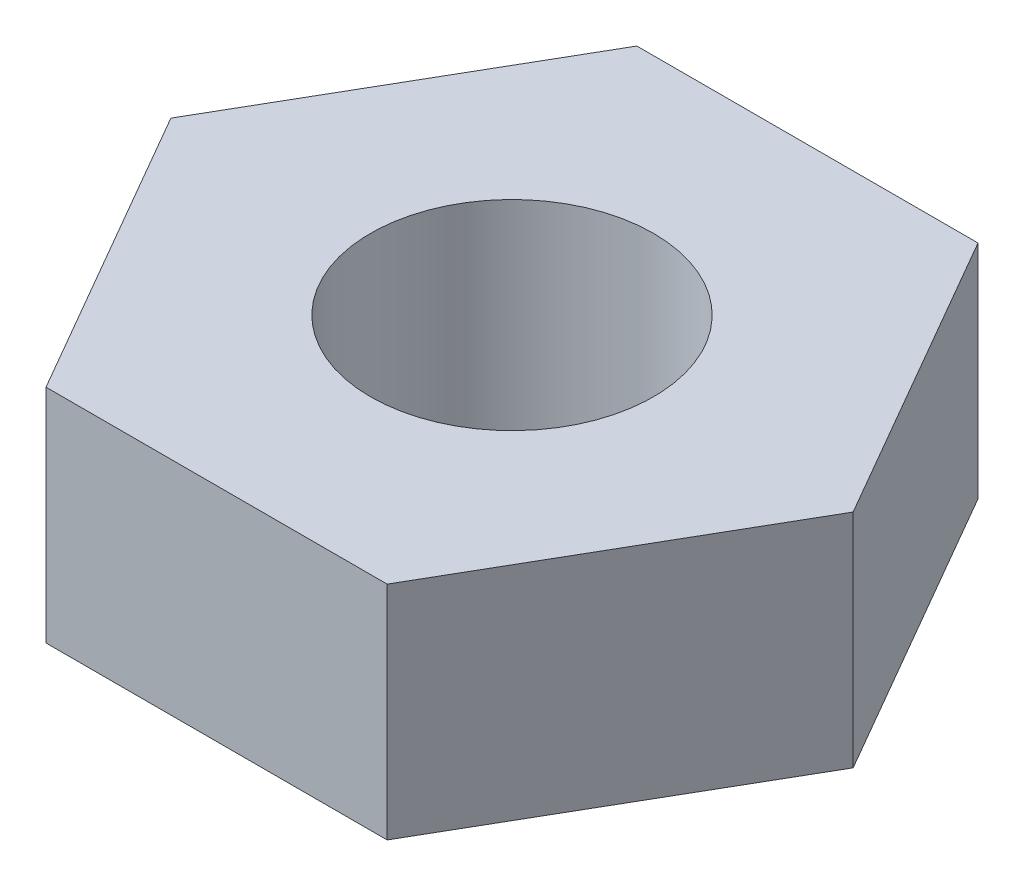
ISO-10303-21;
HEADER;
FILE_DESCRIPTION(('STEP AP214'),'2;1');
FILE_NAME('part.step','',(''),(''),'','','');
FILE_SCHEMA(('AUTOMOTIVE_DESIGN { 1 0 10303 214 1 1 1 1 }'));
ENDSEC;
DATA;
#1=APPLICATION_CONTEXT('core data for automotive mechanical design processes');
#2=APPLICATION_PROTOCOL_DEFINITION('international standard','automotive_design',2000,#1);
#3=PRODUCT_CONTEXT('',#1,'mechanical');
#4=PRODUCT('Part','Part','',(#3));
#5=PRODUCT_RELATED_PRODUCT_CATEGORY('part','',(#4));
#6=PRODUCT_DEFINITION_FORMATION('','',#4);
#7=PRODUCT_DEFINITION_CONTEXT('part definition',#1,'design');
#8=PRODUCT_DEFINITION('design','',#6,#7);
#9=PRODUCT_DEFINITION_SHAPE('','',#8);
#10=(LENGTH_UNIT() NAMED_UNIT(*) SI_UNIT(.MILLI.,.METRE.));
#11=(NAMED_UNIT(*) PLANE_ANGLE_UNIT() SI_UNIT($,.RADIAN.));
#12=(NAMED_UNIT(*) SI_UNIT($,.STERADIAN.) SOLID_ANGLE_UNIT());
#13=UNCERTAINTY_MEASURE_WITH_UNIT(LENGTH_MEASURE(1.E-05),#10,'distance_accuracy_value','');
#14=(GEOMETRIC_REPRESENTATION_CONTEXT(3) GLOBAL_UNCERTAINTY_ASSIGNED_CONTEXT((#13)) GLOBAL_UNIT_ASSIGNED_CONTEXT((#10,
#11,#12)) REPRESENTATION_CONTEXT('',''));
#15=CARTESIAN_POINT('',(0.,0.,0.));
#16=DIRECTION('',(0.,0.,1.));
#17=DIRECTION('',(1.,0.,0.));
#18=AXIS2_PLACEMENT_3D('',#15,#16,#17);
#19=CARTESIAN_POINT('',(0.,1.8,0.));
#20=DIRECTION('',(0.,1.,0.));
#21=DIRECTION('',(0.,0.,1.));
#22=AXIS2_PLACEMENT_3D('',#19,#20,#21);
#23=PLANE('',#22);
#24=DIRECTION('',(0.499999999999995,0.,-0.866025403784441));
#25=VECTOR('',#24,1.);
#26=CARTESIAN_POINT('',(1.38564064605512,1.8,2.39999999999998));
#27=LINE('',#26,#25);
#28=CARTESIAN_POINT('',(1.38564064605512,1.8,2.39999999999998));
#29=VERTEX_POINT('',#28);
#30=CARTESIAN_POINT('',(2.77128129211019,1.8,0.));
#31=VERTEX_POINT('',#30);
#32=EDGE_CURVE('E132',#29,#31,#27,.T.);
#33=ORIENTED_EDGE('',*,*,#32,.T.);
#34=DIRECTION('',(-0.500000000000001,0.,-0.866025403784438));
#35=VECTOR('',#34,1.);
#36=CARTESIAN_POINT('',(2.77128129211019,1.8,0.));
#37=LINE('',#36,#35);
#38=CARTESIAN_POINT('',(1.38564064605509,1.8,-2.39999999999999));
#39=VERTEX_POINT('',#38);
#40=EDGE_CURVE('E90',#31,#39,#37,.T.);
#41=ORIENTED_EDGE('',*,*,#40,.T.);
#42=DIRECTION('',(-1.,0.,0.));
#43=VECTOR('',#42,1.);
#44=CARTESIAN_POINT('',(1.38564064605509,1.8,-2.39999999999999));
#45=LINE('',#44,#43);
#46=CARTESIAN_POINT('',(-1.38564064605511,1.8,-2.39999999999999));
#47=VERTEX_POINT('',#46);
#48=EDGE_CURVE('E103',#39,#47,#45,.T.);
#49=ORIENTED_EDGE('',*,*,#48,.T.);
#50=DIRECTION('',(-0.499999999999995,0.,0.866025403784441));
#51=VECTOR('',#50,1.);
#52=CARTESIAN_POINT('',(-1.38564064605511,1.8,-2.39999999999999));
#53=LINE('',#52,#51);
#54=CARTESIAN_POINT('',(-2.77128129211019,1.8,0.));
#55=VERTEX_POINT('',#54);
#56=EDGE_CURVE('E97',#47,#55,#53,.T.);
#57=ORIENTED_EDGE('',*,*,#56,.T.);
#58=DIRECTION('',(0.500000000000007,0.,0.866025403784435));
#59=VECTOR('',#58,1.);
#60=CARTESIAN_POINT('',(-2.77128129211019,1.8,0.));
#61=LINE('',#60,#59);
#62=CARTESIAN_POINT('',(-1.38564064605507,1.8,2.4));
#63=VERTEX_POINT('',#62);
#64=EDGE_CURVE('E101',#55,#63,#61,.T.);
#65=ORIENTED_EDGE('',*,*,#64,.T.);
#66=DIRECTION('',(1.,0.,0.));
#67=VECTOR('',#66,1.);
#68=CARTESIAN_POINT('',(-1.38564064605507,1.8,2.4));
#69=LINE('',#68,#67);
#70=EDGE_CURVE('E53',#63,#29,#69,.T.);
#71=ORIENTED_EDGE('',*,*,#70,.T.);
#72=EDGE_LOOP('',(#33,#41,#49,#57,#65,#71));
#73=FACE_BOUND('',#72,.T.);
#74=CARTESIAN_POINT('',(0.,1.8,0.));
#75=DIRECTION('',(0.,1.,0.));
#76=DIRECTION('',(0.,0.,1.));
#77=AXIS2_PLACEMENT_3D('',#74,#75,#76);
#78=CIRCLE('',#77,1.15);
#79=CARTESIAN_POINT('',(0.,1.8,1.15));
#80=VERTEX_POINT('',#79);
#81=EDGE_CURVE('E125',#80,#80,#78,.T.);
#82=ORIENTED_EDGE('',*,*,#81,.F.);
#83=EDGE_LOOP('',(#82));
#84=FACE_BOUND('',#83,.T.);
#85=ADVANCED_FACE('F36',(#73,#84),#23,.T.);
#86=CARTESIAN_POINT('',(0.,0.,0.));
#87=DIRECTION('',(0.,1.,0.));
#88=DIRECTION('',(0.,0.,1.));
#89=AXIS2_PLACEMENT_3D('',#86,#87,#88);
#90=PLANE('',#89);
#91=DIRECTION('',(0.499999999999995,0.,-0.866025403784441));
#92=VECTOR('',#91,1.);
#93=CARTESIAN_POINT('',(1.38564064605512,0.,2.39999999999998));
#94=LINE('',#93,#92);
#95=CARTESIAN_POINT('',(1.38564064605512,0.,2.39999999999998));
#96=VERTEX_POINT('',#95);
#97=CARTESIAN_POINT('',(2.77128129211019,0.,0.));
#98=VERTEX_POINT('',#97);
#99=EDGE_CURVE('E121',#96,#98,#94,.T.);
#100=ORIENTED_EDGE('',*,*,#99,.F.);
#101=DIRECTION('',(1.,0.,0.));
#102=VECTOR('',#101,1.);
#103=CARTESIAN_POINT('',(-1.38564064605507,0.,2.4));
#104=LINE('',#103,#102);
#105=CARTESIAN_POINT('',(-1.38564064605507,0.,2.4));
#106=VERTEX_POINT('',#105);
#107=EDGE_CURVE('E82',#106,#96,#104,.T.);
#108=ORIENTED_EDGE('',*,*,#107,.F.);
#109=DIRECTION('',(0.500000000000007,0.,0.866025403784435));
#110=VECTOR('',#109,1.);
#111=CARTESIAN_POINT('',(-2.77128129211019,0.,0.));
#112=LINE('',#111,#110);
#113=CARTESIAN_POINT('',(-2.77128129211019,0.,0.));
#114=VERTEX_POINT('',#113);
#115=EDGE_CURVE('E76',#114,#106,#112,.T.);
#116=ORIENTED_EDGE('',*,*,#115,.F.);
#117=DIRECTION('',(-0.499999999999995,0.,0.866025403784441));
#118=VECTOR('',#117,1.);
#119=CARTESIAN_POINT('',(-1.38564064605511,0.,-2.39999999999999));
#120=LINE('',#119,#118);
#121=CARTESIAN_POINT('',(-1.38564064605511,0.,-2.39999999999999));
#122=VERTEX_POINT('',#121);
#123=EDGE_CURVE('E111',#122,#114,#120,.T.);
#124=ORIENTED_EDGE('',*,*,#123,.F.);
#125=DIRECTION('',(-1.,0.,0.));
#126=VECTOR('',#125,1.);
#127=CARTESIAN_POINT('',(1.38564064605509,0.,-2.39999999999999));
#128=LINE('',#127,#126);
#129=CARTESIAN_POINT('',(1.38564064605509,0.,-2.39999999999999));
#130=VERTEX_POINT('',#129);
#131=EDGE_CURVE('E127',#130,#122,#128,.T.);
#132=ORIENTED_EDGE('',*,*,#131,.F.);
#133=DIRECTION('',(-0.500000000000001,0.,-0.866025403784438));
#134=VECTOR('',#133,1.);
#135=CARTESIAN_POINT('',(2.77128129211019,0.,0.));
#136=LINE('',#135,#134);
#137=EDGE_CURVE('E124',#98,#130,#136,.T.);
#138=ORIENTED_EDGE('',*,*,#137,.F.);
#139=EDGE_LOOP('',(#100,#108,#116,#124,#132,#138));
#140=FACE_BOUND('',#139,.T.);
#141=CARTESIAN_POINT('',(0.,0.,0.));
#142=DIRECTION('',(0.,1.,0.));
#143=DIRECTION('',(0.,0.,1.));
#144=AXIS2_PLACEMENT_3D('',#141,#142,#143);
#145=CIRCLE('',#144,1.15);
#146=CARTESIAN_POINT('',(0.,0.,1.15));
#147=VERTEX_POINT('',#146);
#148=EDGE_CURVE('E225',#147,#147,#145,.T.);
#149=ORIENTED_EDGE('',*,*,#148,.T.);
#150=EDGE_LOOP('',(#149));
#151=FACE_BOUND('',#150,.T.);
#152=ADVANCED_FACE('F141',(#140,#151),#90,.F.);
#153=CARTESIAN_POINT('',(1.38564064605512,1.8,2.39999999999998));
#154=DIRECTION('',(-0.866025403784441,0.,-0.499999999999995));
#155=DIRECTION('',(-0.499999999999995,0.,0.866025403784441));
#156=AXIS2_PLACEMENT_3D('',#153,#154,#155);
#157=PLANE('',#156);
#158=ORIENTED_EDGE('',*,*,#99,.T.);
#159=DIRECTION('',(0.,-1.,0.));
#160=VECTOR('',#159,1.);
#161=CARTESIAN_POINT('',(2.77128129211019,1.8,0.));
#162=LINE('',#161,#160);
#163=EDGE_CURVE('E11',#31,#98,#162,.T.);
#164=ORIENTED_EDGE('',*,*,#163,.F.);
#165=ORIENTED_EDGE('',*,*,#32,.F.);
#166=DIRECTION('',(0.,-1.,0.));
#167=VECTOR('',#166,1.);
#168=CARTESIAN_POINT('',(1.38564064605512,1.8,2.39999999999998));
#169=LINE('',#168,#167);
#170=EDGE_CURVE('E117',#29,#96,#169,.T.);
#171=ORIENTED_EDGE('',*,*,#170,.T.);
#172=EDGE_LOOP('',(#158,#164,#165,#171));
#173=FACE_BOUND('',#172,.T.);
#174=ADVANCED_FACE('F38',(#173),#157,.F.);
#175=CARTESIAN_POINT('',(2.77128129211019,1.8,0.));
#176=DIRECTION('',(-0.866025403784438,0.,0.500000000000001));
#177=DIRECTION('',(0.500000000000001,0.,0.866025403784438));
#178=AXIS2_PLACEMENT_3D('',#175,#176,#177);
#179=PLANE('',#178);
#180=ORIENTED_EDGE('',*,*,#137,.T.);
#181=DIRECTION('',(0.,-1.,0.));
#182=VECTOR('',#181,1.);
#183=CARTESIAN_POINT('',(1.38564064605509,1.8,-2.39999999999999));
#184=LINE('',#183,#182);
#185=EDGE_CURVE('E45',#39,#130,#184,.T.);
#186=ORIENTED_EDGE('',*,*,#185,.F.);
#187=ORIENTED_EDGE('',*,*,#40,.F.);
#188=ORIENTED_EDGE('',*,*,#163,.T.);
#189=EDGE_LOOP('',(#180,#186,#187,#188));
#190=FACE_BOUND('',#189,.T.);
#191=ADVANCED_FACE('F166',(#190),#179,.F.);
#192=CARTESIAN_POINT('',(1.38564064605509,1.8,-2.39999999999999));
#193=DIRECTION('',(0.,0.,1.));
#194=DIRECTION('',(1.,0.,0.));
#195=AXIS2_PLACEMENT_3D('',#192,#193,#194);
#196=PLANE('',#195);
#197=ORIENTED_EDGE('',*,*,#131,.T.);
#198=DIRECTION('',(0.,-1.,0.));
#199=VECTOR('',#198,1.);
#200=CARTESIAN_POINT('',(-1.38564064605511,1.8,-2.39999999999999));
#201=LINE('',#200,#199);
#202=EDGE_CURVE('E112',#47,#122,#201,.T.);
#203=ORIENTED_EDGE('',*,*,#202,.F.);
#204=ORIENTED_EDGE('',*,*,#48,.F.);
#205=ORIENTED_EDGE('',*,*,#185,.T.);
#206=EDGE_LOOP('',(#197,#203,#204,#205));
#207=FACE_BOUND('',#206,.T.);
#208=ADVANCED_FACE('F138',(#207),#196,.F.);
#209=CARTESIAN_POINT('',(-1.38564064605511,1.8,-2.39999999999999));
#210=DIRECTION('',(0.866025403784442,0.,0.499999999999995));
#211=DIRECTION('',(0.499999999999995,0.,-0.866025403784442));
#212=AXIS2_PLACEMENT_3D('',#209,#210,#211);
#213=PLANE('',#212);
#214=ORIENTED_EDGE('',*,*,#123,.T.);
#215=DIRECTION('',(0.,-1.,0.));
#216=VECTOR('',#215,1.);
#217=CARTESIAN_POINT('',(-2.77128129211019,1.8,0.));
#218=LINE('',#217,#216);
#219=EDGE_CURVE('E108',#55,#114,#218,.T.);
#220=ORIENTED_EDGE('',*,*,#219,.F.);
#221=ORIENTED_EDGE('',*,*,#56,.F.);
#222=ORIENTED_EDGE('',*,*,#202,.T.);
#223=EDGE_LOOP('',(#214,#220,#221,#222));
#224=FACE_BOUND('',#223,.T.);
#225=ADVANCED_FACE('F109',(#224),#213,.F.);
#226=CARTESIAN_POINT('',(-2.77128129211019,1.8,0.));
#227=DIRECTION('',(0.866025403784435,0.,-0.500000000000007));
#228=DIRECTION('',(-0.500000000000007,0.,-0.866025403784435));
#229=AXIS2_PLACEMENT_3D('',#226,#227,#228);
#230=PLANE('',#229);
#231=ORIENTED_EDGE('',*,*,#115,.T.);
#232=DIRECTION('',(0.,-1.,0.));
#233=VECTOR('',#232,1.);
#234=CARTESIAN_POINT('',(-1.38564064605507,1.8,2.4));
#235=LINE('',#234,#233);
#236=EDGE_CURVE('E113',#63,#106,#235,.T.);
#237=ORIENTED_EDGE('',*,*,#236,.F.);
#238=ORIENTED_EDGE('',*,*,#64,.F.);
#239=ORIENTED_EDGE('',*,*,#219,.T.);
#240=EDGE_LOOP('',(#231,#237,#238,#239));
#241=FACE_BOUND('',#240,.T.);
#242=ADVANCED_FACE('F115',(#241),#230,.F.);
#243=CARTESIAN_POINT('',(-1.38564064605507,1.8,2.4));
#244=DIRECTION('',(0.,0.,-1.));
#245=DIRECTION('',(-1.,0.,0.));
#246=AXIS2_PLACEMENT_3D('',#243,#244,#245);
#247=PLANE('',#246);
#248=ORIENTED_EDGE('',*,*,#107,.T.);
#249=ORIENTED_EDGE('',*,*,#170,.F.);
#250=ORIENTED_EDGE('',*,*,#70,.F.);
#251=ORIENTED_EDGE('',*,*,#236,.T.);
#252=EDGE_LOOP('',(#248,#249,#250,#251));
#253=FACE_BOUND('',#252,.T.);
#254=ADVANCED_FACE('F146',(#253),#247,.F.);
#255=CARTESIAN_POINT('',(0.,1.8,0.));
#256=DIRECTION('',(0.,-1.,0.));
#257=DIRECTION('',(0.,0.,-1.));
#258=AXIS2_PLACEMENT_3D('',#255,#256,#257);
#259=CYLINDRICAL_SURFACE('',#258,1.15);
#260=ORIENTED_EDGE('',*,*,#81,.T.);
#261=EDGE_LOOP('',(#260));
#262=FACE_BOUND('',#261,.T.);
#263=ORIENTED_EDGE('',*,*,#148,.F.);
#264=EDGE_LOOP('',(#263));
#265=FACE_BOUND('',#264,.T.);
#266=ADVANCED_FACE('F148',(#262,#265),#259,.F.);
#267=CLOSED_SHELL('',(#85,#152,#174,#191,#208,#225,#242,#254,#266));
#268=MANIFOLD_SOLID_BREP('B2',#267);
#269=ADVANCED_BREP_SHAPE_REPRESENTATION('',(#18,#268),#14);
#270=SHAPE_DEFINITION_REPRESENTATION(#9,#269);
ENDSEC;
END-ISO-10303-21;
